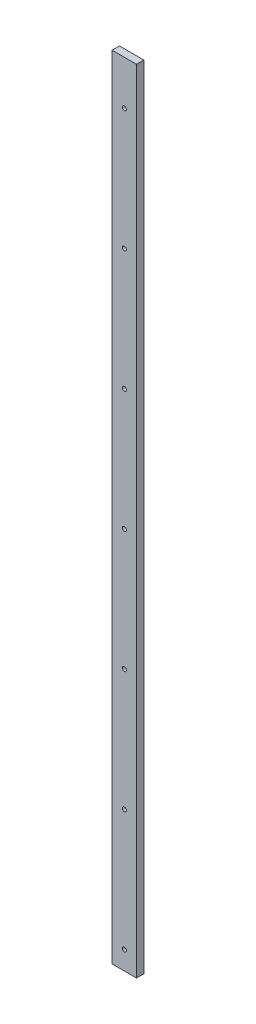
ISO-10303-21;
HEADER;
FILE_DESCRIPTION(('STEP AP214'),'2;1');
FILE_NAME('part.step','',(''),(''),'','','');
FILE_SCHEMA(('AUTOMOTIVE_DESIGN { 1 0 10303 214 1 1 1 1 }'));
ENDSEC;
DATA;
#1=APPLICATION_CONTEXT('core data for automotive mechanical design processes');
#2=APPLICATION_PROTOCOL_DEFINITION('international standard','automotive_design',2000,#1);
#3=PRODUCT_CONTEXT('',#1,'mechanical');
#4=PRODUCT('Part','Part','',(#3));
#5=PRODUCT_RELATED_PRODUCT_CATEGORY('part','',(#4));
#6=PRODUCT_DEFINITION_FORMATION('','',#4);
#7=PRODUCT_DEFINITION_CONTEXT('part definition',#1,'design');
#8=PRODUCT_DEFINITION('design','',#6,#7);
#9=PRODUCT_DEFINITION_SHAPE('','',#8);
#10=(LENGTH_UNIT() NAMED_UNIT(*) SI_UNIT(.MILLI.,.METRE.));
#11=(NAMED_UNIT(*) PLANE_ANGLE_UNIT() SI_UNIT($,.RADIAN.));
#12=(NAMED_UNIT(*) SI_UNIT($,.STERADIAN.) SOLID_ANGLE_UNIT());
#13=UNCERTAINTY_MEASURE_WITH_UNIT(LENGTH_MEASURE(1.E-05),#10,'distance_accuracy_value','');
#14=(GEOMETRIC_REPRESENTATION_CONTEXT(3) GLOBAL_UNCERTAINTY_ASSIGNED_CONTEXT((#13)) GLOBAL_UNIT_ASSIGNED_CONTEXT((#10,
#11,#12)) REPRESENTATION_CONTEXT('',''));
#15=CARTESIAN_POINT('',(0.,0.,0.));
#16=DIRECTION('',(0.,0.,1.));
#17=DIRECTION('',(1.,0.,0.));
#18=AXIS2_PLACEMENT_3D('',#15,#16,#17);
#19=CARTESIAN_POINT('',(20.,-1303.36,6.));
#20=DIRECTION('',(1.,0.,0.));
#21=DIRECTION('',(0.,0.,-1.));
#22=AXIS2_PLACEMENT_3D('',#19,#20,#21);
#23=PLANE('',#22);
#24=DIRECTION('',(0.,0.,-1.));
#25=VECTOR('',#24,1.);
#26=CARTESIAN_POINT('',(20.,0.,6.));
#27=LINE('',#26,#25);
#28=CARTESIAN_POINT('',(20.,0.,6.));
#29=VERTEX_POINT('',#28);
#30=CARTESIAN_POINT('',(20.,0.,-6.));
#31=VERTEX_POINT('',#30);
#32=EDGE_CURVE('E98',#29,#31,#27,.T.);
#33=ORIENTED_EDGE('',*,*,#32,.F.);
#34=DIRECTION('',(0.,1.,0.));
#35=VECTOR('',#34,1.);
#36=CARTESIAN_POINT('',(20.,-1303.36,6.));
#37=LINE('',#36,#35);
#38=CARTESIAN_POINT('',(20.,-1303.36,6.));
#39=VERTEX_POINT('',#38);
#40=EDGE_CURVE('E11',#39,#29,#37,.T.);
#41=ORIENTED_EDGE('',*,*,#40,.F.);
#42=DIRECTION('',(0.,0.,-1.));
#43=VECTOR('',#42,1.);
#44=CARTESIAN_POINT('',(20.,-1303.36,6.));
#45=LINE('',#44,#43);
#46=CARTESIAN_POINT('',(20.,-1303.36,-6.));
#47=VERTEX_POINT('',#46);
#48=EDGE_CURVE('E91',#39,#47,#45,.T.);
#49=ORIENTED_EDGE('',*,*,#48,.T.);
#50=DIRECTION('',(0.,1.,0.));
#51=VECTOR('',#50,1.);
#52=CARTESIAN_POINT('',(20.,-1303.36,-6.));
#53=LINE('',#52,#51);
#54=EDGE_CURVE('E36',#47,#31,#53,.T.);
#55=ORIENTED_EDGE('',*,*,#54,.T.);
#56=EDGE_LOOP('',(#33,#41,#49,#55));
#57=FACE_BOUND('',#56,.T.);
#58=ADVANCED_FACE('F33',(#57),#23,.T.);
#59=CARTESIAN_POINT('',(-20.,-1303.36,6.));
#60=DIRECTION('',(0.,0.,1.));
#61=DIRECTION('',(1.,0.,0.));
#62=AXIS2_PLACEMENT_3D('',#59,#60,#61);
#63=PLANE('',#62);
#64=CARTESIAN_POINT('',(0.,-1272.83,6.));
#65=DIRECTION('',(0.,0.,1.));
#66=DIRECTION('',(1.,0.,0.));
#67=AXIS2_PLACEMENT_3D('',#64,#65,#66);
#68=CIRCLE('',#67,3.39999999999999);
#69=CARTESIAN_POINT('',(3.39999999999999,-1272.83,6.));
#70=VERTEX_POINT('',#69);
#71=EDGE_CURVE('E170',#70,#70,#68,.T.);
#72=ORIENTED_EDGE('',*,*,#71,.F.);
#73=EDGE_LOOP('',(#72));
#74=FACE_BOUND('',#73,.T.);
#75=CARTESIAN_POINT('',(0.,-672.83,6.));
#76=DIRECTION('',(0.,0.,1.));
#77=DIRECTION('',(1.,0.,0.));
#78=AXIS2_PLACEMENT_3D('',#75,#76,#77);
#79=CIRCLE('',#78,3.39999999999999);
#80=CARTESIAN_POINT('',(3.39999999999999,-672.83,6.));
#81=VERTEX_POINT('',#80);
#82=EDGE_CURVE('E174',#81,#81,#79,.T.);
#83=ORIENTED_EDGE('',*,*,#82,.F.);
#84=EDGE_LOOP('',(#83));
#85=FACE_BOUND('',#84,.T.);
#86=CARTESIAN_POINT('',(0.,-72.8299999999998,6.));
#87=DIRECTION('',(0.,0.,1.));
#88=DIRECTION('',(1.,0.,0.));
#89=AXIS2_PLACEMENT_3D('',#86,#87,#88);
#90=CIRCLE('',#89,3.39999999999999);
#91=CARTESIAN_POINT('',(3.39999999999999,-72.8299999999998,6.));
#92=VERTEX_POINT('',#91);
#93=EDGE_CURVE('E178',#92,#92,#90,.T.);
#94=ORIENTED_EDGE('',*,*,#93,.F.);
#95=EDGE_LOOP('',(#94));
#96=FACE_BOUND('',#95,.T.);
#97=CARTESIAN_POINT('',(0.,-272.83,6.));
#98=DIRECTION('',(0.,0.,1.));
#99=DIRECTION('',(1.,0.,0.));
#100=AXIS2_PLACEMENT_3D('',#97,#98,#99);
#101=CIRCLE('',#100,3.39999999999999);
#102=CARTESIAN_POINT('',(3.39999999999999,-272.83,6.));
#103=VERTEX_POINT('',#102);
#104=EDGE_CURVE('E158',#103,#103,#101,.T.);
#105=ORIENTED_EDGE('',*,*,#104,.F.);
#106=EDGE_LOOP('',(#105));
#107=FACE_BOUND('',#106,.T.);
#108=CARTESIAN_POINT('',(0.,-472.83,6.));
#109=DIRECTION('',(0.,0.,1.));
#110=DIRECTION('',(1.,0.,0.));
#111=AXIS2_PLACEMENT_3D('',#108,#109,#110);
#112=CIRCLE('',#111,3.39999999999999);
#113=CARTESIAN_POINT('',(3.39999999999999,-472.83,6.));
#114=VERTEX_POINT('',#113);
#115=EDGE_CURVE('E162',#114,#114,#112,.T.);
#116=ORIENTED_EDGE('',*,*,#115,.F.);
#117=EDGE_LOOP('',(#116));
#118=FACE_BOUND('',#117,.T.);
#119=CARTESIAN_POINT('',(0.,-872.83,6.));
#120=DIRECTION('',(0.,0.,1.));
#121=DIRECTION('',(1.,0.,0.));
#122=AXIS2_PLACEMENT_3D('',#119,#120,#121);
#123=CIRCLE('',#122,3.39999999999999);
#124=CARTESIAN_POINT('',(3.39999999999999,-872.83,6.));
#125=VERTEX_POINT('',#124);
#126=EDGE_CURVE('E166',#125,#125,#123,.T.);
#127=ORIENTED_EDGE('',*,*,#126,.F.);
#128=EDGE_LOOP('',(#127));
#129=FACE_BOUND('',#128,.T.);
#130=CARTESIAN_POINT('',(0.,-1072.83,6.));
#131=DIRECTION('',(0.,0.,1.));
#132=DIRECTION('',(1.,0.,0.));
#133=AXIS2_PLACEMENT_3D('',#130,#131,#132);
#134=CIRCLE('',#133,3.39999999999999);
#135=CARTESIAN_POINT('',(3.39999999999999,-1072.83,6.));
#136=VERTEX_POINT('',#135);
#137=EDGE_CURVE('E154',#136,#136,#134,.T.);
#138=ORIENTED_EDGE('',*,*,#137,.F.);
#139=EDGE_LOOP('',(#138));
#140=FACE_BOUND('',#139,.T.);
#141=DIRECTION('',(1.,0.,0.));
#142=VECTOR('',#141,1.);
#143=CARTESIAN_POINT('',(-20.,0.,6.));
#144=LINE('',#143,#142);
#145=CARTESIAN_POINT('',(-20.,0.,6.));
#146=VERTEX_POINT('',#145);
#147=EDGE_CURVE('E93',#146,#29,#144,.T.);
#148=ORIENTED_EDGE('',*,*,#147,.F.);
#149=DIRECTION('',(0.,1.,0.));
#150=VECTOR('',#149,1.);
#151=CARTESIAN_POINT('',(-20.,-1303.36,6.));
#152=LINE('',#151,#150);
#153=CARTESIAN_POINT('',(-20.,-1303.36,6.));
#154=VERTEX_POINT('',#153);
#155=EDGE_CURVE('E42',#154,#146,#152,.T.);
#156=ORIENTED_EDGE('',*,*,#155,.F.);
#157=DIRECTION('',(1.,0.,0.));
#158=VECTOR('',#157,1.);
#159=CARTESIAN_POINT('',(-20.,-1303.36,6.));
#160=LINE('',#159,#158);
#161=EDGE_CURVE('E88',#154,#39,#160,.T.);
#162=ORIENTED_EDGE('',*,*,#161,.T.);
#163=ORIENTED_EDGE('',*,*,#40,.T.);
#164=EDGE_LOOP('',(#148,#156,#162,#163));
#165=FACE_BOUND('',#164,.T.);
#166=ADVANCED_FACE('F109',(#74,#85,#96,#107,#118,#129,#140,#165),#63,.T.);
#167=CARTESIAN_POINT('',(-20.,-1303.36,6.));
#168=DIRECTION('',(-1.,0.,0.));
#169=DIRECTION('',(0.,0.,1.));
#170=AXIS2_PLACEMENT_3D('',#167,#168,#169);
#171=PLANE('',#170);
#172=DIRECTION('',(0.,0.,1.));
#173=VECTOR('',#172,1.);
#174=CARTESIAN_POINT('',(-20.,0.,6.));
#175=LINE('',#174,#173);
#176=CARTESIAN_POINT('',(-20.,0.,-6.));
#177=VERTEX_POINT('',#176);
#178=EDGE_CURVE('E83',#177,#146,#175,.T.);
#179=ORIENTED_EDGE('',*,*,#178,.F.);
#180=DIRECTION('',(0.,1.,0.));
#181=VECTOR('',#180,1.);
#182=CARTESIAN_POINT('',(-20.,-1303.36,-6.));
#183=LINE('',#182,#181);
#184=CARTESIAN_POINT('',(-20.,-1303.36,-6.));
#185=VERTEX_POINT('',#184);
#186=EDGE_CURVE('E78',#185,#177,#183,.T.);
#187=ORIENTED_EDGE('',*,*,#186,.F.);
#188=DIRECTION('',(0.,0.,1.));
#189=VECTOR('',#188,1.);
#190=CARTESIAN_POINT('',(-20.,-1303.36,6.));
#191=LINE('',#190,#189);
#192=EDGE_CURVE('E81',#185,#154,#191,.T.);
#193=ORIENTED_EDGE('',*,*,#192,.T.);
#194=ORIENTED_EDGE('',*,*,#155,.T.);
#195=EDGE_LOOP('',(#179,#187,#193,#194));
#196=FACE_BOUND('',#195,.T.);
#197=ADVANCED_FACE('F80',(#196),#171,.T.);
#198=CARTESIAN_POINT('',(-20.,-1303.36,-6.));
#199=DIRECTION('',(0.,0.,-1.));
#200=DIRECTION('',(-1.,0.,0.));
#201=AXIS2_PLACEMENT_3D('',#198,#199,#200);
#202=PLANE('',#201);
#203=CARTESIAN_POINT('',(0.,-1272.83,-6.));
#204=DIRECTION('',(0.,0.,1.));
#205=DIRECTION('',(1.,0.,0.));
#206=AXIS2_PLACEMENT_3D('',#203,#204,#205);
#207=CIRCLE('',#206,3.39999999999999);
#208=CARTESIAN_POINT('',(3.39999999999999,-1272.83,-6.));
#209=VERTEX_POINT('',#208);
#210=EDGE_CURVE('E130',#209,#209,#207,.T.);
#211=ORIENTED_EDGE('',*,*,#210,.T.);
#212=EDGE_LOOP('',(#211));
#213=FACE_BOUND('',#212,.T.);
#214=CARTESIAN_POINT('',(0.,-672.83,-6.));
#215=DIRECTION('',(0.,0.,1.));
#216=DIRECTION('',(1.,0.,0.));
#217=AXIS2_PLACEMENT_3D('',#214,#215,#216);
#218=CIRCLE('',#217,3.39999999999999);
#219=CARTESIAN_POINT('',(3.39999999999999,-672.83,-6.));
#220=VERTEX_POINT('',#219);
#221=EDGE_CURVE('E134',#220,#220,#218,.T.);
#222=ORIENTED_EDGE('',*,*,#221,.T.);
#223=EDGE_LOOP('',(#222));
#224=FACE_BOUND('',#223,.T.);
#225=CARTESIAN_POINT('',(0.,-72.8299999999998,-6.));
#226=DIRECTION('',(0.,0.,1.));
#227=DIRECTION('',(1.,0.,0.));
#228=AXIS2_PLACEMENT_3D('',#225,#226,#227);
#229=CIRCLE('',#228,3.39999999999999);
#230=CARTESIAN_POINT('',(3.39999999999999,-72.8299999999998,-6.));
#231=VERTEX_POINT('',#230);
#232=EDGE_CURVE('E138',#231,#231,#229,.T.);
#233=ORIENTED_EDGE('',*,*,#232,.T.);
#234=EDGE_LOOP('',(#233));
#235=FACE_BOUND('',#234,.T.);
#236=CARTESIAN_POINT('',(0.,-272.83,-6.));
#237=DIRECTION('',(0.,0.,1.));
#238=DIRECTION('',(1.,0.,0.));
#239=AXIS2_PLACEMENT_3D('',#236,#237,#238);
#240=CIRCLE('',#239,3.39999999999999);
#241=CARTESIAN_POINT('',(3.39999999999999,-272.83,-6.));
#242=VERTEX_POINT('',#241);
#243=EDGE_CURVE('E142',#242,#242,#240,.T.);
#244=ORIENTED_EDGE('',*,*,#243,.T.);
#245=EDGE_LOOP('',(#244));
#246=FACE_BOUND('',#245,.T.);
#247=CARTESIAN_POINT('',(0.,-472.83,-6.));
#248=DIRECTION('',(0.,0.,1.));
#249=DIRECTION('',(1.,0.,0.));
#250=AXIS2_PLACEMENT_3D('',#247,#248,#249);
#251=CIRCLE('',#250,3.39999999999999);
#252=CARTESIAN_POINT('',(3.39999999999999,-472.83,-6.));
#253=VERTEX_POINT('',#252);
#254=EDGE_CURVE('E146',#253,#253,#251,.T.);
#255=ORIENTED_EDGE('',*,*,#254,.T.);
#256=EDGE_LOOP('',(#255));
#257=FACE_BOUND('',#256,.T.);
#258=CARTESIAN_POINT('',(0.,-872.83,-6.));
#259=DIRECTION('',(0.,0.,1.));
#260=DIRECTION('',(1.,0.,0.));
#261=AXIS2_PLACEMENT_3D('',#258,#259,#260);
#262=CIRCLE('',#261,3.39999999999999);
#263=CARTESIAN_POINT('',(3.39999999999999,-872.83,-6.));
#264=VERTEX_POINT('',#263);
#265=EDGE_CURVE('E150',#264,#264,#262,.T.);
#266=ORIENTED_EDGE('',*,*,#265,.T.);
#267=EDGE_LOOP('',(#266));
#268=FACE_BOUND('',#267,.T.);
#269=CARTESIAN_POINT('',(0.,-1072.83,-6.));
#270=DIRECTION('',(0.,0.,1.));
#271=DIRECTION('',(1.,0.,0.));
#272=AXIS2_PLACEMENT_3D('',#269,#270,#271);
#273=CIRCLE('',#272,3.39999999999999);
#274=CARTESIAN_POINT('',(3.39999999999999,-1072.83,-6.));
#275=VERTEX_POINT('',#274);
#276=EDGE_CURVE('E102',#275,#275,#273,.T.);
#277=ORIENTED_EDGE('',*,*,#276,.T.);
#278=EDGE_LOOP('',(#277));
#279=FACE_BOUND('',#278,.T.);
#280=DIRECTION('',(-1.,0.,0.));
#281=VECTOR('',#280,1.);
#282=CARTESIAN_POINT('',(-20.,0.,-6.));
#283=LINE('',#282,#281);
#284=EDGE_CURVE('E101',#31,#177,#283,.T.);
#285=ORIENTED_EDGE('',*,*,#284,.F.);
#286=ORIENTED_EDGE('',*,*,#54,.F.);
#287=DIRECTION('',(-1.,0.,0.));
#288=VECTOR('',#287,1.);
#289=CARTESIAN_POINT('',(-20.,-1303.36,-6.));
#290=LINE('',#289,#288);
#291=EDGE_CURVE('E87',#47,#185,#290,.T.);
#292=ORIENTED_EDGE('',*,*,#291,.T.);
#293=ORIENTED_EDGE('',*,*,#186,.T.);
#294=EDGE_LOOP('',(#285,#286,#292,#293));
#295=FACE_BOUND('',#294,.T.);
#296=ADVANCED_FACE('F90',(#213,#224,#235,#246,#257,#268,#279,#295),#202,.T.);
#297=CARTESIAN_POINT('',(0.,-1303.36,0.));
#298=DIRECTION('',(0.,-1.,0.));
#299=DIRECTION('',(0.,0.,-1.));
#300=AXIS2_PLACEMENT_3D('',#297,#298,#299);
#301=PLANE('',#300);
#302=ORIENTED_EDGE('',*,*,#48,.F.);
#303=ORIENTED_EDGE('',*,*,#161,.F.);
#304=ORIENTED_EDGE('',*,*,#192,.F.);
#305=ORIENTED_EDGE('',*,*,#291,.F.);
#306=EDGE_LOOP('',(#302,#303,#304,#305));
#307=FACE_BOUND('',#306,.T.);
#308=ADVANCED_FACE('F86',(#307),#301,.T.);
#309=CARTESIAN_POINT('',(0.,0.,0.));
#310=DIRECTION('',(0.,-1.,0.));
#311=DIRECTION('',(0.,0.,-1.));
#312=AXIS2_PLACEMENT_3D('',#309,#310,#311);
#313=PLANE('',#312);
#314=ORIENTED_EDGE('',*,*,#32,.T.);
#315=ORIENTED_EDGE('',*,*,#284,.T.);
#316=ORIENTED_EDGE('',*,*,#178,.T.);
#317=ORIENTED_EDGE('',*,*,#147,.T.);
#318=EDGE_LOOP('',(#314,#315,#316,#317));
#319=FACE_BOUND('',#318,.T.);
#320=ADVANCED_FACE('F108',(#319),#313,.F.);
#321=CARTESIAN_POINT('',(0.,-1072.83,-6.));
#322=DIRECTION('',(0.,0.,1.));
#323=DIRECTION('',(1.,0.,0.));
#324=AXIS2_PLACEMENT_3D('',#321,#322,#323);
#325=CYLINDRICAL_SURFACE('',#324,3.39999999999999);
#326=ORIENTED_EDGE('',*,*,#276,.F.);
#327=EDGE_LOOP('',(#326));
#328=FACE_BOUND('',#327,.T.);
#329=ORIENTED_EDGE('',*,*,#137,.T.);
#330=EDGE_LOOP('',(#329));
#331=FACE_BOUND('',#330,.T.);
#332=ADVANCED_FACE('F194',(#328,#331),#325,.F.);
#333=CARTESIAN_POINT('',(0.,-872.83,-6.));
#334=DIRECTION('',(0.,0.,1.));
#335=DIRECTION('',(1.,0.,0.));
#336=AXIS2_PLACEMENT_3D('',#333,#334,#335);
#337=CYLINDRICAL_SURFACE('',#336,3.39999999999999);
#338=ORIENTED_EDGE('',*,*,#265,.F.);
#339=EDGE_LOOP('',(#338));
#340=FACE_BOUND('',#339,.T.);
#341=ORIENTED_EDGE('',*,*,#126,.T.);
#342=EDGE_LOOP('',(#341));
#343=FACE_BOUND('',#342,.T.);
#344=ADVANCED_FACE('F196',(#340,#343),#337,.F.);
#345=CARTESIAN_POINT('',(0.,-472.83,-6.));
#346=DIRECTION('',(0.,0.,1.));
#347=DIRECTION('',(1.,0.,0.));
#348=AXIS2_PLACEMENT_3D('',#345,#346,#347);
#349=CYLINDRICAL_SURFACE('',#348,3.39999999999999);
#350=ORIENTED_EDGE('',*,*,#254,.F.);
#351=EDGE_LOOP('',(#350));
#352=FACE_BOUND('',#351,.T.);
#353=ORIENTED_EDGE('',*,*,#115,.T.);
#354=EDGE_LOOP('',(#353));
#355=FACE_BOUND('',#354,.T.);
#356=ADVANCED_FACE('F202',(#352,#355),#349,.F.);
#357=CARTESIAN_POINT('',(0.,-272.83,-6.));
#358=DIRECTION('',(0.,0.,1.));
#359=DIRECTION('',(1.,0.,0.));
#360=AXIS2_PLACEMENT_3D('',#357,#358,#359);
#361=CYLINDRICAL_SURFACE('',#360,3.39999999999999);
#362=ORIENTED_EDGE('',*,*,#243,.F.);
#363=EDGE_LOOP('',(#362));
#364=FACE_BOUND('',#363,.T.);
#365=ORIENTED_EDGE('',*,*,#104,.T.);
#366=EDGE_LOOP('',(#365));
#367=FACE_BOUND('',#366,.T.);
#368=ADVANCED_FACE('F206',(#364,#367),#361,.F.);
#369=CARTESIAN_POINT('',(0.,-72.8299999999998,-6.));
#370=DIRECTION('',(0.,0.,1.));
#371=DIRECTION('',(1.,0.,0.));
#372=AXIS2_PLACEMENT_3D('',#369,#370,#371);
#373=CYLINDRICAL_SURFACE('',#372,3.39999999999999);
#374=ORIENTED_EDGE('',*,*,#232,.F.);
#375=EDGE_LOOP('',(#374));
#376=FACE_BOUND('',#375,.T.);
#377=ORIENTED_EDGE('',*,*,#93,.T.);
#378=EDGE_LOOP('',(#377));
#379=FACE_BOUND('',#378,.T.);
#380=ADVANCED_FACE('F183',(#376,#379),#373,.F.);
#381=CARTESIAN_POINT('',(0.,-672.83,-6.));
#382=DIRECTION('',(0.,0.,1.));
#383=DIRECTION('',(1.,0.,0.));
#384=AXIS2_PLACEMENT_3D('',#381,#382,#383);
#385=CYLINDRICAL_SURFACE('',#384,3.39999999999999);
#386=ORIENTED_EDGE('',*,*,#221,.F.);
#387=EDGE_LOOP('',(#386));
#388=FACE_BOUND('',#387,.T.);
#389=ORIENTED_EDGE('',*,*,#82,.T.);
#390=EDGE_LOOP('',(#389));
#391=FACE_BOUND('',#390,.T.);
#392=ADVANCED_FACE('F216',(#388,#391),#385,.F.);
#393=CARTESIAN_POINT('',(0.,-1272.83,-6.));
#394=DIRECTION('',(0.,0.,1.));
#395=DIRECTION('',(1.,0.,0.));
#396=AXIS2_PLACEMENT_3D('',#393,#394,#395);
#397=CYLINDRICAL_SURFACE('',#396,3.39999999999999);
#398=ORIENTED_EDGE('',*,*,#210,.F.);
#399=EDGE_LOOP('',(#398));
#400=FACE_BOUND('',#399,.T.);
#401=ORIENTED_EDGE('',*,*,#71,.T.);
#402=EDGE_LOOP('',(#401));
#403=FACE_BOUND('',#402,.T.);
#404=ADVANCED_FACE('F213',(#400,#403),#397,.F.);
#405=CLOSED_SHELL('',(#58,#166,#197,#296,#308,#320,#332,#344,#356,#368,#380,#392,#404));
#406=MANIFOLD_SOLID_BREP('B2',#405);
#407=ADVANCED_BREP_SHAPE_REPRESENTATION('',(#18,#406),#14);
#408=SHAPE_DEFINITION_REPRESENTATION(#9,#407);
ENDSEC;
END-ISO-10303-21;
